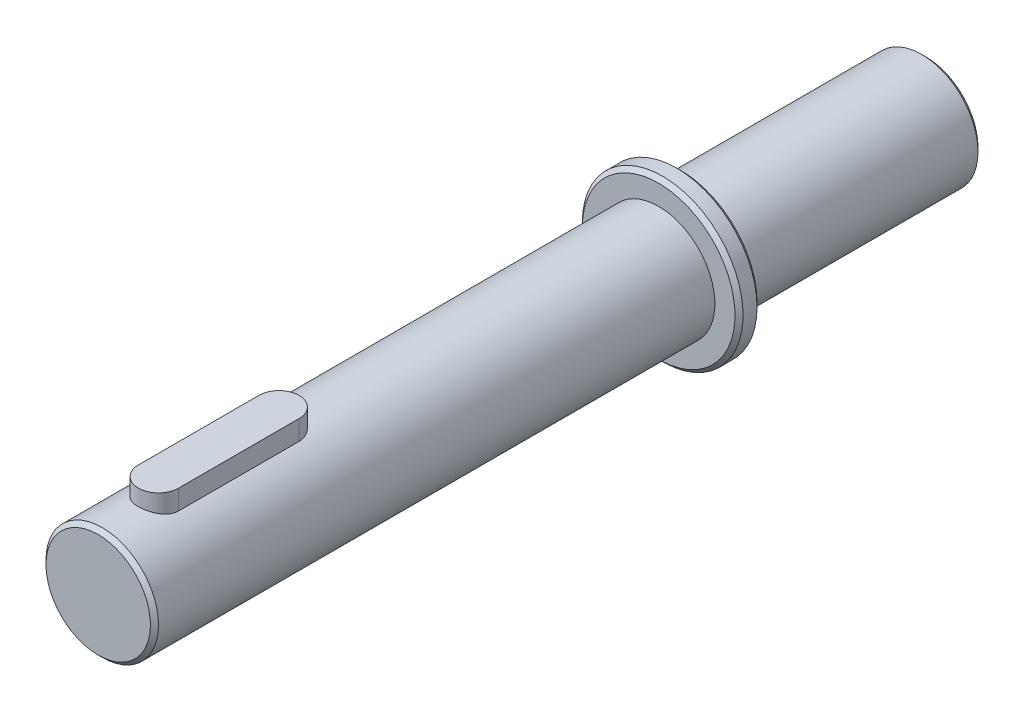
ISO-10303-21;
HEADER;
FILE_DESCRIPTION(('STEP AP214'),'2;1');
FILE_NAME('part.step','',(''),(''),'','','');
FILE_SCHEMA(('AUTOMOTIVE_DESIGN { 1 0 10303 214 1 1 1 1 }'));
ENDSEC;
DATA;
#1=APPLICATION_CONTEXT('core data for automotive mechanical design processes');
#2=APPLICATION_PROTOCOL_DEFINITION('international standard','automotive_design',2000,#1);
#3=PRODUCT_CONTEXT('',#1,'mechanical');
#4=PRODUCT('Part','Part','',(#3));
#5=PRODUCT_RELATED_PRODUCT_CATEGORY('part','',(#4));
#6=PRODUCT_DEFINITION_FORMATION('','',#4);
#7=PRODUCT_DEFINITION_CONTEXT('part definition',#1,'design');
#8=PRODUCT_DEFINITION('design','',#6,#7);
#9=PRODUCT_DEFINITION_SHAPE('','',#8);
#10=(LENGTH_UNIT() NAMED_UNIT(*) SI_UNIT(.MILLI.,.METRE.));
#11=(NAMED_UNIT(*) PLANE_ANGLE_UNIT() SI_UNIT($,.RADIAN.));
#12=(NAMED_UNIT(*) SI_UNIT($,.STERADIAN.) SOLID_ANGLE_UNIT());
#13=UNCERTAINTY_MEASURE_WITH_UNIT(LENGTH_MEASURE(1.E-05),#10,'distance_accuracy_value','');
#14=(GEOMETRIC_REPRESENTATION_CONTEXT(3) GLOBAL_UNCERTAINTY_ASSIGNED_CONTEXT((#13)) GLOBAL_UNIT_ASSIGNED_CONTEXT((#10,
#11,#12)) REPRESENTATION_CONTEXT('',''));
#15=CARTESIAN_POINT('',(0.,0.,0.));
#16=DIRECTION('',(0.,0.,1.));
#17=DIRECTION('',(1.,0.,0.));
#18=AXIS2_PLACEMENT_3D('',#15,#16,#17);
#19=CARTESIAN_POINT('',(0.,0.,103.));
#20=DIRECTION('',(0.,0.,-1.));
#21=DIRECTION('',(-1.,0.,0.));
#22=AXIS2_PLACEMENT_3D('',#19,#20,#21);
#23=CYLINDRICAL_SURFACE('',#22,7.);
#24=CARTESIAN_POINT('',(0.,0.,0.500000000000014));
#25=DIRECTION('',(0.,0.,1.));
#26=DIRECTION('',(1.,0.,0.));
#27=AXIS2_PLACEMENT_3D('',#24,#25,#26);
#28=CIRCLE('',#27,7.);
#29=CARTESIAN_POINT('',(7.,0.,0.500000000000014));
#30=VERTEX_POINT('',#29);
#31=EDGE_CURVE('E122',#30,#30,#28,.T.);
#32=ORIENTED_EDGE('',*,*,#31,.T.);
#33=EDGE_LOOP('',(#32));
#34=FACE_BOUND('',#33,.T.);
#35=CARTESIAN_POINT('',(0.,0.,30.5));
#36=DIRECTION('',(0.,0.,1.));
#37=DIRECTION('',(1.,0.,0.));
#38=AXIS2_PLACEMENT_3D('',#35,#36,#37);
#39=CIRCLE('',#38,7.);
#40=CARTESIAN_POINT('',(7.,0.,30.5));
#41=VERTEX_POINT('',#40);
#42=EDGE_CURVE('E113',#41,#41,#39,.T.);
#43=ORIENTED_EDGE('',*,*,#42,.F.);
#44=EDGE_LOOP('',(#43));
#45=FACE_BOUND('',#44,.T.);
#46=ADVANCED_FACE('F36',(#34,#45),#23,.T.);
#47=CARTESIAN_POINT('',(0.,0.,0.));
#48=DIRECTION('',(0.,0.,1.));
#49=DIRECTION('',(1.,0.,0.));
#50=AXIS2_PLACEMENT_3D('',#47,#48,#49);
#51=PLANE('',#50);
#52=CARTESIAN_POINT('',(0.,0.,0.));
#53=DIRECTION('',(0.,0.,1.));
#54=DIRECTION('',(1.,0.,0.));
#55=AXIS2_PLACEMENT_3D('',#52,#53,#54);
#56=CIRCLE('',#55,6.49999999999998);
#57=CARTESIAN_POINT('',(6.49999999999998,0.,0.));
#58=VERTEX_POINT('',#57);
#59=EDGE_CURVE('E125',#58,#58,#56,.F.);
#60=ORIENTED_EDGE('',*,*,#59,.T.);
#61=EDGE_LOOP('',(#60));
#62=FACE_BOUND('',#61,.T.);
#63=ADVANCED_FACE('F175',(#62),#51,.F.);
#64=CARTESIAN_POINT('',(0.,0.,0.));
#65=DIRECTION('',(0.,0.,-1.));
#66=DIRECTION('',(-1.,0.,0.));
#67=AXIS2_PLACEMENT_3D('',#64,#65,#66);
#68=CYLINDRICAL_SURFACE('',#67,10.);
#69=CARTESIAN_POINT('',(0.,0.,31.));
#70=DIRECTION('',(0.,0.,1.));
#71=DIRECTION('',(1.,0.,0.));
#72=AXIS2_PLACEMENT_3D('',#69,#70,#71);
#73=CIRCLE('',#72,10.);
#74=CARTESIAN_POINT('',(10.,0.,31.));
#75=VERTEX_POINT('',#74);
#76=EDGE_CURVE('E134',#75,#75,#73,.T.);
#77=ORIENTED_EDGE('',*,*,#76,.T.);
#78=EDGE_LOOP('',(#77));
#79=FACE_BOUND('',#78,.T.);
#80=CARTESIAN_POINT('',(0.,0.,32.75));
#81=DIRECTION('',(0.,0.,-1.));
#82=DIRECTION('',(-1.,0.,0.));
#83=AXIS2_PLACEMENT_3D('',#80,#81,#82);
#84=CIRCLE('',#83,10.);
#85=CARTESIAN_POINT('',(-10.,0.,32.75));
#86=VERTEX_POINT('',#85);
#87=EDGE_CURVE('E131',#86,#86,#84,.T.);
#88=ORIENTED_EDGE('',*,*,#87,.T.);
#89=EDGE_LOOP('',(#88));
#90=FACE_BOUND('',#89,.T.);
#91=ADVANCED_FACE('F171',(#79,#90),#68,.T.);
#92=CARTESIAN_POINT('',(5.,0.,30.5));
#93=DIRECTION('',(0.,0.,1.));
#94=DIRECTION('',(1.,0.,0.));
#95=AXIS2_PLACEMENT_3D('',#92,#93,#94);
#96=PLANE('',#95);
#97=CARTESIAN_POINT('',(0.,0.,30.5));
#98=DIRECTION('',(0.,0.,1.));
#99=DIRECTION('',(1.,0.,0.));
#100=AXIS2_PLACEMENT_3D('',#97,#98,#99);
#101=CIRCLE('',#100,9.50000000000002);
#102=CARTESIAN_POINT('',(9.50000000000002,0.,30.5));
#103=VERTEX_POINT('',#102);
#104=EDGE_CURVE('E128',#103,#103,#101,.F.);
#105=ORIENTED_EDGE('',*,*,#104,.T.);
#106=EDGE_LOOP('',(#105));
#107=FACE_BOUND('',#106,.T.);
#108=ORIENTED_EDGE('',*,*,#42,.T.);
#109=EDGE_LOOP('',(#108));
#110=FACE_BOUND('',#109,.T.);
#111=ADVANCED_FACE('F167',(#107,#110),#96,.F.);
#112=CARTESIAN_POINT('',(5.,0.,33.25));
#113=DIRECTION('',(0.,0.,-1.));
#114=DIRECTION('',(-1.,0.,0.));
#115=AXIS2_PLACEMENT_3D('',#112,#113,#114);
#116=PLANE('',#115);
#117=CARTESIAN_POINT('',(0.,0.,33.25));
#118=DIRECTION('',(0.,0.,-1.));
#119=DIRECTION('',(-1.,0.,0.));
#120=AXIS2_PLACEMENT_3D('',#117,#118,#119);
#121=CIRCLE('',#120,9.50000000000001);
#122=CARTESIAN_POINT('',(-9.5,0.,33.25));
#123=VERTEX_POINT('',#122);
#124=EDGE_CURVE('E137',#123,#123,#121,.F.);
#125=ORIENTED_EDGE('',*,*,#124,.T.);
#126=EDGE_LOOP('',(#125));
#127=FACE_BOUND('',#126,.T.);
#128=CARTESIAN_POINT('',(0.,0.,33.25));
#129=DIRECTION('',(0.,0.,-1.));
#130=DIRECTION('',(-1.,0.,0.));
#131=AXIS2_PLACEMENT_3D('',#128,#129,#130);
#132=CIRCLE('',#131,7.);
#133=CARTESIAN_POINT('',(-7.,0.,33.25));
#134=VERTEX_POINT('',#133);
#135=EDGE_CURVE('E107',#134,#134,#132,.T.);
#136=ORIENTED_EDGE('',*,*,#135,.T.);
#137=EDGE_LOOP('',(#136));
#138=FACE_BOUND('',#137,.T.);
#139=ADVANCED_FACE('F163',(#127,#138),#116,.F.);
#140=CARTESIAN_POINT('',(0.,0.,103.));
#141=DIRECTION('',(0.,0.,1.));
#142=DIRECTION('',(1.,0.,0.));
#143=AXIS2_PLACEMENT_3D('',#140,#141,#142);
#144=PLANE('',#143);
#145=CARTESIAN_POINT('',(0.,0.,103.));
#146=DIRECTION('',(0.,0.,1.));
#147=DIRECTION('',(1.,0.,0.));
#148=AXIS2_PLACEMENT_3D('',#145,#146,#147);
#149=CIRCLE('',#148,6.50000000000001);
#150=CARTESIAN_POINT('',(6.50000000000001,0.,103.));
#151=VERTEX_POINT('',#150);
#152=EDGE_CURVE('E116',#151,#151,#149,.T.);
#153=ORIENTED_EDGE('',*,*,#152,.T.);
#154=EDGE_LOOP('',(#153));
#155=FACE_BOUND('',#154,.T.);
#156=ADVANCED_FACE('F166',(#155),#144,.T.);
#157=DIRECTION('',(0.,0.,-1.));
#158=VECTOR('',#157,1.);
#159=CARTESIAN_POINT('',(-2.5,6.53834841531101,103.));
#160=LINE('',#159,#158);
#161=CARTESIAN_POINT('',(-2.5,6.53834841531101,95.5));
#162=VERTEX_POINT('',#161);
#163=CARTESIAN_POINT('',(-2.5,6.53834841531101,80.5));
#164=VERTEX_POINT('',#163);
#165=EDGE_CURVE('E140',#162,#164,#160,.T.);
#166=ORIENTED_EDGE('',*,*,#165,.T.);
#167=CARTESIAN_POINT('',(0.,7.,83.));
#168=CARTESIAN_POINT('',(-0.135839760518732,7.0000020295295,83.0000028240419));
#169=CARTESIAN_POINT('',(-0.271659429947528,6.99601056603649,82.9888932427672));
#170=CARTESIAN_POINT('',(-0.539264896606894,6.98048404948616,82.9449087128079));
#171=CARTESIAN_POINT('',(-0.671050847614626,6.96894928437749,82.9120345949352));
#172=CARTESIAN_POINT('',(-0.926692116674314,6.93958109810981,82.8258148587326));
#173=CARTESIAN_POINT('',(-1.05056137145919,6.92175912724346,82.7725064402801));
#174=CARTESIAN_POINT('',(-1.28759585298401,6.88161078032354,82.6471112806324));
#175=CARTESIAN_POINT('',(-1.40075850640075,6.85928332539979,82.575020040551));
#176=CARTESIAN_POINT('',(-1.61758802805346,6.81147377429754,82.4111568678836));
#177=CARTESIAN_POINT('',(-1.72078015672851,6.78590827445072,82.3187812689946));
#178=CARTESIAN_POINT('',(-1.9105819932243,6.73493522536265,82.1182536362102));
#179=CARTESIAN_POINT('',(-1.99718728701346,6.70952771990193,82.0100974162836));
#180=CARTESIAN_POINT('',(-2.15423735561842,6.6608007016897,81.7766022072243));
#181=CARTESIAN_POINT('',(-2.22403529794829,6.63758107761794,81.6508052564835));
#182=CARTESIAN_POINT('',(-2.34127572230002,6.59714352451506,81.3882963352957));
#183=CARTESIAN_POINT('',(-2.38872619231546,6.57992345154766,81.2515882854323));
#184=CARTESIAN_POINT('',(-2.45809130448528,6.55432038222057,80.9765771637975));
#185=CARTESIAN_POINT('',(-2.48090519407331,6.54562733379002,80.8385306930569));
#186=CARTESIAN_POINT('',(-2.5031615222748,6.53715061879805,80.5603163681762));
#187=CARTESIAN_POINT('',(-2.50261249605974,6.53736369856128,80.4201493074584));
#188=CARTESIAN_POINT('',(-2.4788507897233,6.54640588297195,80.1496443449475));
#189=CARTESIAN_POINT('',(-2.45685161763648,6.5547736366904,80.0191816470003));
#190=CARTESIAN_POINT('',(-2.39280851055059,6.57842082174382,79.7639384728166));
#191=CARTESIAN_POINT('',(-2.35076183734613,6.59370119723067,79.6391587753492));
#192=CARTESIAN_POINT('',(-2.247095668441,6.62975170487813,79.3962262542143));
#193=CARTESIAN_POINT('',(-2.18514195933256,6.65061447775042,79.2782303973415));
#194=CARTESIAN_POINT('',(-2.04365272690694,6.69544469696369,79.0539436133503));
#195=CARTESIAN_POINT('',(-1.96411154980233,6.71941314064672,78.9476564666926));
#196=CARTESIAN_POINT('',(-1.78403149047108,6.76952498465894,78.7430404086289));
#197=CARTESIAN_POINT('',(-1.68251331515439,6.7957122347435,78.6455821407508));
#198=CARTESIAN_POINT('',(-1.46426184534915,6.84605473605515,78.4688283171652));
#199=CARTESIAN_POINT('',(-1.3475266301937,6.87020973014027,78.3895350577013));
#200=CARTESIAN_POINT('',(-1.10010034292176,6.91416998722002,78.2505193900608));
#201=CARTESIAN_POINT('',(-0.969249112425213,6.93391532170414,78.1910617601102));
#202=CARTESIAN_POINT('',(-0.69852346812725,6.96639167687354,78.0952841758396));
#203=CARTESIAN_POINT('',(-0.558652699053769,6.97912551125634,78.0589549392374));
#204=CARTESIAN_POINT('',(-0.281205091813835,6.99566202632136,78.0120808493404));
#205=CARTESIAN_POINT('',(-0.143850613169093,6.99987103999093,78.0003618692543));
#206=CARTESIAN_POINT('',(0.130909371573395,7.00012297890716,77.9996548780098));
#207=CARTESIAN_POINT('',(0.268314862212673,6.99616751856457,78.0106623730082));
#208=CARTESIAN_POINT('',(0.534368698997773,6.98080349995239,78.0541861373216));
#209=CARTESIAN_POINT('',(0.663155848081403,6.96965417819419,78.0859547557982));
#210=CARTESIAN_POINT('',(0.913499444029998,6.94128245796678,78.1691365947361));
#211=CARTESIAN_POINT('',(1.03505494970017,6.9240592709991,78.2205523658286));
#212=CARTESIAN_POINT('',(1.27131790851501,6.88465739573327,78.3431588534016));
#213=CARTESIAN_POINT('',(1.38573546298722,6.86235262462323,78.4148664804994));
#214=CARTESIAN_POINT('',(1.6012793689737,6.81528395513799,78.5754274951074));
#215=CARTESIAN_POINT('',(1.70240114063959,6.79051921453451,78.6642867647738));
#216=CARTESIAN_POINT('',(1.89402292059753,6.73966040960453,78.8621296327289));
#217=CARTESIAN_POINT('',(1.98368681906969,6.71356479866296,78.9719247130197));
#218=CARTESIAN_POINT('',(2.14345525781598,6.6642787599771,79.2055412700044));
#219=CARTESIAN_POINT('',(2.21355884309556,6.64108847411013,79.3293634311286));
#220=CARTESIAN_POINT('',(2.33208686094212,6.60040332956606,79.5880648092361));
#221=CARTESIAN_POINT('',(2.38048810756041,6.58291456759543,79.7229556705099));
#222=CARTESIAN_POINT('',(2.45361419016748,6.55601442004241,79.9997601007201));
#223=CARTESIAN_POINT('',(2.4783518546378,6.54659865821928,80.1416698206623));
#224=CARTESIAN_POINT('',(2.50236255506863,6.53745596427834,80.419520479373));
#225=CARTESIAN_POINT('',(2.50304426978182,6.53719306756498,80.5553232144244));
#226=CARTESIAN_POINT('',(2.48247035008869,6.54503319463772,80.8249976706549));
#227=CARTESIAN_POINT('',(2.46121642244208,6.55313556754228,80.9588695412482));
#228=CARTESIAN_POINT('',(2.39843007607193,6.57636700427785,81.2175005853719));
#229=CARTESIAN_POINT('',(2.35741961008935,6.59131474248996,81.3424040990058));
#230=CARTESIAN_POINT('',(2.25672644338171,6.62646329315119,81.5836426818669));
#231=CARTESIAN_POINT('',(2.19703924956895,6.64666536944648,81.6999756809442));
#232=CARTESIAN_POINT('',(2.05730313071904,6.69127230994833,81.9269257499522));
#233=CARTESIAN_POINT('',(1.97640371595173,6.71583400336863,82.0369880408629));
#234=CARTESIAN_POINT('',(1.79790863011924,6.76580411328317,82.2424275046605));
#235=CARTESIAN_POINT('',(1.70030791033581,6.79121278393859,82.337800220351));
#236=CARTESIAN_POINT('',(1.48566252339524,6.84145445667706,82.5157219028166));
#237=CARTESIAN_POINT('',(1.36791750616705,6.86620367070764,82.5974530397909));
#238=CARTESIAN_POINT('',(1.11951131249464,6.91104924401845,82.7399076638379));
#239=CARTESIAN_POINT('',(0.988851114158942,6.93114595526313,82.8006327402027));
#240=CARTESIAN_POINT('',(0.71764633652499,6.96446006180832,82.8991403103086));
#241=CARTESIAN_POINT('',(0.57706256046779,6.97764821973896,82.9368254081627));
#242=CARTESIAN_POINT('',(0.290976881134825,6.99541542277591,82.9872488746388));
#243=CARTESIAN_POINT('',(0.14547691909783,6.99999782648543,82.9999969756064));
#244=CARTESIAN_POINT('',(0.,7.,83.));
#245=B_SPLINE_CURVE_WITH_KNOTS('',3,(#167,#168,#169,#170,#171,#172,#173,#174,#175,#176,#177,
#178,#179,#180,#181,#182,#183,#184,#185,#186,#187,#188,#189,#190,#191,#192,#193,#194,#195,#196,
#197,#198,#199,#200,#201,#202,#203,#204,#205,#206,#207,#208,#209,#210,#211,#212,#213,#214,#215,
#216,#217,#218,#219,#220,#221,#222,#223,#224,#225,#226,#227,#228,#229,#230,#231,#232,#233,#234,
#235,#236,#237,#238,#239,#240,#241,#242,#243,#244),.UNSPECIFIED.,.T.,.F.,(4,2,2,2,2,2,2,2,2,2,2,
2,2,2,2,2,2,2,2,2,2,2,2,2,2,2,2,2,2,2,2,2,2,2,2,2,2,2,4),(0.,0.406983217142951,
0.813950899519933,1.22018120425629,1.62650889940498,2.04714572459521,2.46789433314936,
2.90289606780333,3.3377421950035,3.75611562378725,4.17433620956453,4.57019246497949,
4.96610280426156,5.36904149669469,5.77210990935867,6.19956653135136,6.62707715847136,
7.06008524763626,7.49291944485573,7.90458529912081,8.31616976000826,8.71369326802827,
9.11126840085792,9.52005856953122,9.92898918269314,10.3593838463852,10.7897995195909,
11.2206739431307,11.6513146487842,12.0566930957309,12.4620400035307,12.8572208236401,
13.2524967861626,13.6670344525245,14.0816976535747,14.5159343578492,14.9501382011315,
15.3861650682914,15.8220217300551),.UNSPECIFIED.);
#246=CARTESIAN_POINT('',(2.5,6.53834841531101,80.5));
#247=VERTEX_POINT('',#246);
#248=EDGE_CURVE('E11',#164,#247,#245,.T.);
#249=ORIENTED_EDGE('',*,*,#248,.T.);
#250=DIRECTION('',(0.,0.,-1.));
#251=VECTOR('',#250,1.);
#252=CARTESIAN_POINT('',(2.5,6.53834841531101,103.));
#253=LINE('',#252,#251);
#254=CARTESIAN_POINT('',(2.5,6.53834841531101,95.5));
#255=VERTEX_POINT('',#254);
#256=EDGE_CURVE('E50',#247,#255,#253,.F.);
#257=ORIENTED_EDGE('',*,*,#256,.T.);
#258=CARTESIAN_POINT('',(0.,7.,98.));
#259=CARTESIAN_POINT('',(-0.135839760518735,7.0000020295295,98.0000028240419));
#260=CARTESIAN_POINT('',(-0.271659429947531,6.99601056603649,97.9888932427672));
#261=CARTESIAN_POINT('',(-0.539264896606898,6.98048404948616,97.9449087128079));
#262=CARTESIAN_POINT('',(-0.671050847614628,6.96894928437749,97.9120345949352));
#263=CARTESIAN_POINT('',(-0.926692116674318,6.93958109810981,97.8258148587326));
#264=CARTESIAN_POINT('',(-1.05056137145919,6.92175912724346,97.7725064402801));
#265=CARTESIAN_POINT('',(-1.28759585298402,6.88161078032354,97.6471112806324));
#266=CARTESIAN_POINT('',(-1.40075850640075,6.85928332539979,97.575020040551));
#267=CARTESIAN_POINT('',(-1.61758802805347,6.81147377429754,97.4111568678836));
#268=CARTESIAN_POINT('',(-1.72078015672851,6.78590827445072,97.3187812689946));
#269=CARTESIAN_POINT('',(-1.9105819932243,6.73493522536265,97.1182536362102));
#270=CARTESIAN_POINT('',(-1.99718728701346,6.70952771990193,97.0100974162836));
#271=CARTESIAN_POINT('',(-2.15423735561842,6.6608007016897,96.7766022072243));
#272=CARTESIAN_POINT('',(-2.2240352979483,6.63758107761794,96.6508052564835));
#273=CARTESIAN_POINT('',(-2.34127572230003,6.59714352451506,96.3882963352957));
#274=CARTESIAN_POINT('',(-2.38872619231546,6.57992345154766,96.2515882854323));
#275=CARTESIAN_POINT('',(-2.45809130448528,6.55432038222057,95.9765771637975));
#276=CARTESIAN_POINT('',(-2.48090519407331,6.54562733379002,95.8385306930569));
#277=CARTESIAN_POINT('',(-2.5031615222748,6.53715061879805,95.5603163681762));
#278=CARTESIAN_POINT('',(-2.50261249605974,6.53736369856128,95.4201493074584));
#279=CARTESIAN_POINT('',(-2.4788507897233,6.54640588297195,95.1496443449475));
#280=CARTESIAN_POINT('',(-2.45685161763648,6.5547736366904,95.0191816470003));
#281=CARTESIAN_POINT('',(-2.3928085105506,6.57842082174382,94.7639384728166));
#282=CARTESIAN_POINT('',(-2.35076183734613,6.59370119723067,94.6391587753492));
#283=CARTESIAN_POINT('',(-2.247095668441,6.62975170487813,94.3962262542143));
#284=CARTESIAN_POINT('',(-2.18514195933256,6.65061447775042,94.2782303973415));
#285=CARTESIAN_POINT('',(-2.04365272690694,6.69544469696369,94.0539436133503));
#286=CARTESIAN_POINT('',(-1.96411154980232,6.71941314064672,93.9476564666926));
#287=CARTESIAN_POINT('',(-1.78403149047108,6.76952498465894,93.7430404086289));
#288=CARTESIAN_POINT('',(-1.68251331515438,6.7957122347435,93.6455821407508));
#289=CARTESIAN_POINT('',(-1.46426184534915,6.84605473605515,93.4688283171652));
#290=CARTESIAN_POINT('',(-1.3475266301937,6.87020973014027,93.3895350577013));
#291=CARTESIAN_POINT('',(-1.10010034292176,6.91416998722001,93.2505193900608));
#292=CARTESIAN_POINT('',(-0.969249112425217,6.93391532170414,93.1910617601102));
#293=CARTESIAN_POINT('',(-0.698523468127255,6.96639167687354,93.0952841758396));
#294=CARTESIAN_POINT('',(-0.558652699053772,6.97912551125635,93.0589549392374));
#295=CARTESIAN_POINT('',(-0.281205091813837,6.99566202632136,93.0120808493404));
#296=CARTESIAN_POINT('',(-0.143850613169095,6.99987103999093,93.0003618692543));
#297=CARTESIAN_POINT('',(0.130909371573393,7.00012297890716,92.9996548780098));
#298=CARTESIAN_POINT('',(0.268314862212672,6.99616751856457,93.0106623730082));
#299=CARTESIAN_POINT('',(0.53436869899777,6.98080349995239,93.0541861373216));
#300=CARTESIAN_POINT('',(0.663155848081399,6.96965417819419,93.0859547557982));
#301=CARTESIAN_POINT('',(0.913499444029994,6.94128245796678,93.1691365947361));
#302=CARTESIAN_POINT('',(1.03505494970017,6.9240592709991,93.2205523658286));
#303=CARTESIAN_POINT('',(1.27131790851501,6.88465739573327,93.3431588534016));
#304=CARTESIAN_POINT('',(1.38573546298722,6.86235262462323,93.4148664804994));
#305=CARTESIAN_POINT('',(1.60127936897371,6.81528395513799,93.5754274951074));
#306=CARTESIAN_POINT('',(1.70240114063959,6.79051921453451,93.6642867647738));
#307=CARTESIAN_POINT('',(1.89402292059753,6.73966040960453,93.8621296327289));
#308=CARTESIAN_POINT('',(1.9836868190697,6.71356479866296,93.9719247130197));
#309=CARTESIAN_POINT('',(2.14345525781599,6.66427875997709,94.2055412700044));
#310=CARTESIAN_POINT('',(2.21355884309556,6.64108847411013,94.3293634311286));
#311=CARTESIAN_POINT('',(2.33208686094212,6.60040332956606,94.5880648092361));
#312=CARTESIAN_POINT('',(2.3804881075604,6.58291456759543,94.7229556705099));
#313=CARTESIAN_POINT('',(2.45361419016748,6.55601442004241,94.9997601007201));
#314=CARTESIAN_POINT('',(2.4783518546378,6.54659865821928,95.1416698206623));
#315=CARTESIAN_POINT('',(2.50236255506862,6.53745596427834,95.419520479373));
#316=CARTESIAN_POINT('',(2.50304426978182,6.53719306756498,95.5553232144244));
#317=CARTESIAN_POINT('',(2.48247035008869,6.54503319463772,95.8249976706549));
#318=CARTESIAN_POINT('',(2.46121642244208,6.55313556754228,95.9588695412482));
#319=CARTESIAN_POINT('',(2.39843007607193,6.57636700427785,96.2175005853719));
#320=CARTESIAN_POINT('',(2.35741961008935,6.59131474248996,96.3424040990058));
#321=CARTESIAN_POINT('',(2.2567264433817,6.62646329315119,96.5836426818669));
#322=CARTESIAN_POINT('',(2.19703924956894,6.64666536944648,96.6999756809442));
#323=CARTESIAN_POINT('',(2.05730313071904,6.69127230994833,96.9269257499523));
#324=CARTESIAN_POINT('',(1.97640371595173,6.71583400336863,97.0369880408629));
#325=CARTESIAN_POINT('',(1.79790863011923,6.76580411328317,97.2424275046605));
#326=CARTESIAN_POINT('',(1.70030791033581,6.79121278393859,97.337800220351));
#327=CARTESIAN_POINT('',(1.48566252339524,6.84145445667706,97.5157219028166));
#328=CARTESIAN_POINT('',(1.36791750616705,6.86620367070764,97.5974530397909));
#329=CARTESIAN_POINT('',(1.11951131249464,6.91104924401845,97.7399076638379));
#330=CARTESIAN_POINT('',(0.98885111415894,6.93114595526313,97.8006327402027));
#331=CARTESIAN_POINT('',(0.717646336524988,6.96446006180832,97.8991403103086));
#332=CARTESIAN_POINT('',(0.577062560467788,6.97764821973896,97.9368254081627));
#333=CARTESIAN_POINT('',(0.290976881134824,6.99541542277591,97.9872488746388));
#334=CARTESIAN_POINT('',(0.145476919097828,6.99999782648543,97.9999969756064));
#335=CARTESIAN_POINT('',(0.,7.,98.));
#336=B_SPLINE_CURVE_WITH_KNOTS('',3,(#258,#259,#260,#261,#262,#263,#264,#265,#266,#267,#268,
#269,#270,#271,#272,#273,#274,#275,#276,#277,#278,#279,#280,#281,#282,#283,#284,#285,#286,#287,
#288,#289,#290,#291,#292,#293,#294,#295,#296,#297,#298,#299,#300,#301,#302,#303,#304,#305,#306,
#307,#308,#309,#310,#311,#312,#313,#314,#315,#316,#317,#318,#319,#320,#321,#322,#323,#324,#325,
#326,#327,#328,#329,#330,#331,#332,#333,#334,#335),.UNSPECIFIED.,.T.,.F.,(4,2,2,2,2,2,2,2,2,2,2,
2,2,2,2,2,2,2,2,2,2,2,2,2,2,2,2,2,2,2,2,2,2,2,2,2,2,2,4),(0.,0.406983217142953,
0.813950899519933,1.2201812042563,1.62650889940498,2.04714572459521,2.46789433314938,
2.90289606780335,3.3377421950035,3.75611562378725,4.17433620956453,4.57019246497948,
4.96610280426156,5.3690414966947,5.77210990935867,6.19956653135137,6.62707715847136,
7.06008524763626,7.49291944485573,7.90458529912081,8.31616976000826,8.71369326802827,
9.11126840085792,9.52005856953123,9.92898918269314,10.3593838463852,10.7897995195909,
11.2206739431307,11.6513146487842,12.0566930957309,12.4620400035307,12.8572208236401,
13.2524967861626,13.6670344525245,14.0816976535747,14.5159343578492,14.9501382011315,
15.3861650682914,15.8220217300551),.UNSPECIFIED.);
#337=EDGE_CURVE('E142',#255,#162,#336,.T.);
#338=ORIENTED_EDGE('',*,*,#337,.T.);
#339=EDGE_LOOP('',(#166,#249,#257,#338));
#340=FACE_BOUND('',#339,.T.);
#341=CARTESIAN_POINT('',(0.,0.,102.5));
#342=DIRECTION('',(0.,0.,1.));
#343=DIRECTION('',(1.,0.,0.));
#344=AXIS2_PLACEMENT_3D('',#341,#342,#343);
#345=CIRCLE('',#344,7.);
#346=CARTESIAN_POINT('',(7.,0.,102.5));
#347=VERTEX_POINT('',#346);
#348=EDGE_CURVE('E119',#347,#347,#345,.F.);
#349=ORIENTED_EDGE('',*,*,#348,.T.);
#350=EDGE_LOOP('',(#349));
#351=FACE_BOUND('',#350,.T.);
#352=ORIENTED_EDGE('',*,*,#135,.F.);
#353=EDGE_LOOP('',(#352));
#354=FACE_BOUND('',#353,.T.);
#355=ADVANCED_FACE('F178',(#340,#351,#354),#23,.T.);
#356=CARTESIAN_POINT('',(0.,0.,103.));
#357=DIRECTION('',(0.,0.,-1.));
#358=DIRECTION('',(-1.,0.,0.));
#359=AXIS2_PLACEMENT_3D('',#356,#357,#358);
#360=CONICAL_SURFACE('',#359,6.50000000000001,0.785398163397455);
#361=ORIENTED_EDGE('',*,*,#348,.F.);
#362=EDGE_LOOP('',(#361));
#363=FACE_BOUND('',#362,.T.);
#364=ORIENTED_EDGE('',*,*,#152,.F.);
#365=EDGE_LOOP('',(#364));
#366=FACE_BOUND('',#365,.T.);
#367=ADVANCED_FACE('F192',(#363,#366),#360,.T.);
#368=CARTESIAN_POINT('',(0.,0.,0.500000000000014));
#369=DIRECTION('',(0.,0.,1.));
#370=DIRECTION('',(1.,0.,0.));
#371=AXIS2_PLACEMENT_3D('',#368,#369,#370);
#372=CONICAL_SURFACE('',#371,7.,0.785398163397454);
#373=ORIENTED_EDGE('',*,*,#59,.F.);
#374=EDGE_LOOP('',(#373));
#375=FACE_BOUND('',#374,.T.);
#376=ORIENTED_EDGE('',*,*,#31,.F.);
#377=EDGE_LOOP('',(#376));
#378=FACE_BOUND('',#377,.T.);
#379=ADVANCED_FACE('F188',(#375,#378),#372,.T.);
#380=CARTESIAN_POINT('',(0.,0.,30.5));
#381=DIRECTION('',(0.,0.,1.));
#382=DIRECTION('',(1.,0.,0.));
#383=AXIS2_PLACEMENT_3D('',#380,#381,#382);
#384=CONICAL_SURFACE('',#383,9.50000000000002,0.785398163397441);
#385=ORIENTED_EDGE('',*,*,#76,.F.);
#386=EDGE_LOOP('',(#385));
#387=FACE_BOUND('',#386,.T.);
#388=ORIENTED_EDGE('',*,*,#104,.F.);
#389=EDGE_LOOP('',(#388));
#390=FACE_BOUND('',#389,.T.);
#391=ADVANCED_FACE('F191',(#387,#390),#384,.T.);
#392=CARTESIAN_POINT('',(0.,0.,32.75));
#393=DIRECTION('',(0.,0.,-1.));
#394=DIRECTION('',(-1.,0.,0.));
#395=AXIS2_PLACEMENT_3D('',#392,#393,#394);
#396=CONICAL_SURFACE('',#395,10.,0.785398163397428);
#397=ORIENTED_EDGE('',*,*,#124,.F.);
#398=EDGE_LOOP('',(#397));
#399=FACE_BOUND('',#398,.T.);
#400=ORIENTED_EDGE('',*,*,#87,.F.);
#401=EDGE_LOOP('',(#400));
#402=FACE_BOUND('',#401,.T.);
#403=ADVANCED_FACE('F39',(#399,#402),#396,.T.);
#404=CARTESIAN_POINT('',(0.,5.,80.5));
#405=DIRECTION('',(0.,1.,0.));
#406=DIRECTION('',(0.,0.,1.));
#407=AXIS2_PLACEMENT_3D('',#404,#405,#406);
#408=CYLINDRICAL_SURFACE('',#407,2.5);
#409=ORIENTED_EDGE('',*,*,#248,.F.);
#410=DIRECTION('',(0.,1.,0.));
#411=VECTOR('',#410,1.);
#412=CARTESIAN_POINT('',(-2.5,5.,80.5));
#413=LINE('',#412,#411);
#414=CARTESIAN_POINT('',(-2.5,9.,80.5));
#415=VERTEX_POINT('',#414);
#416=EDGE_CURVE('E57',#164,#415,#413,.T.);
#417=ORIENTED_EDGE('',*,*,#416,.T.);
#418=CARTESIAN_POINT('',(0.,9.,80.5));
#419=DIRECTION('',(0.,1.,0.));
#420=DIRECTION('',(0.,0.,1.));
#421=AXIS2_PLACEMENT_3D('',#418,#419,#420);
#422=CIRCLE('',#421,2.5);
#423=CARTESIAN_POINT('',(2.5,9.,80.5));
#424=VERTEX_POINT('',#423);
#425=EDGE_CURVE('E84',#424,#415,#422,.T.);
#426=ORIENTED_EDGE('',*,*,#425,.F.);
#427=DIRECTION('',(0.,1.,0.));
#428=VECTOR('',#427,1.);
#429=CARTESIAN_POINT('',(2.5,5.,80.5));
#430=LINE('',#429,#428);
#431=EDGE_CURVE('E105',#247,#424,#430,.T.);
#432=ORIENTED_EDGE('',*,*,#431,.F.);
#433=EDGE_LOOP('',(#409,#417,#426,#432));
#434=FACE_BOUND('',#433,.T.);
#435=ADVANCED_FACE('F82',(#434),#408,.T.);
#436=CARTESIAN_POINT('',(2.5,5.,80.5));
#437=DIRECTION('',(1.,0.,0.));
#438=DIRECTION('',(0.,0.,-1.));
#439=AXIS2_PLACEMENT_3D('',#436,#437,#438);
#440=PLANE('',#439);
#441=ORIENTED_EDGE('',*,*,#256,.F.);
#442=ORIENTED_EDGE('',*,*,#431,.T.);
#443=DIRECTION('',(0.,0.,-1.));
#444=VECTOR('',#443,1.);
#445=CARTESIAN_POINT('',(2.5,9.,80.5));
#446=LINE('',#445,#444);
#447=CARTESIAN_POINT('',(2.5,9.,95.5));
#448=VERTEX_POINT('',#447);
#449=EDGE_CURVE('E87',#448,#424,#446,.T.);
#450=ORIENTED_EDGE('',*,*,#449,.F.);
#451=DIRECTION('',(0.,1.,0.));
#452=VECTOR('',#451,1.);
#453=CARTESIAN_POINT('',(2.5,5.,95.5));
#454=LINE('',#453,#452);
#455=EDGE_CURVE('E108',#255,#448,#454,.T.);
#456=ORIENTED_EDGE('',*,*,#455,.F.);
#457=EDGE_LOOP('',(#441,#442,#450,#456));
#458=FACE_BOUND('',#457,.T.);
#459=ADVANCED_FACE('F156',(#458),#440,.T.);
#460=CARTESIAN_POINT('',(0.,5.,95.5));
#461=DIRECTION('',(0.,1.,0.));
#462=DIRECTION('',(0.,0.,1.));
#463=AXIS2_PLACEMENT_3D('',#460,#461,#462);
#464=CYLINDRICAL_SURFACE('',#463,2.5);
#465=ORIENTED_EDGE('',*,*,#337,.F.);
#466=ORIENTED_EDGE('',*,*,#455,.T.);
#467=CARTESIAN_POINT('',(0.,9.,95.5));
#468=DIRECTION('',(0.,1.,0.));
#469=DIRECTION('',(0.,0.,1.));
#470=AXIS2_PLACEMENT_3D('',#467,#468,#469);
#471=CIRCLE('',#470,2.5);
#472=CARTESIAN_POINT('',(-2.5,9.,95.5));
#473=VERTEX_POINT('',#472);
#474=EDGE_CURVE('E96',#473,#448,#471,.T.);
#475=ORIENTED_EDGE('',*,*,#474,.F.);
#476=DIRECTION('',(0.,1.,0.));
#477=VECTOR('',#476,1.);
#478=CARTESIAN_POINT('',(-2.5,5.,95.5));
#479=LINE('',#478,#477);
#480=EDGE_CURVE('E86',#162,#473,#479,.T.);
#481=ORIENTED_EDGE('',*,*,#480,.F.);
#482=EDGE_LOOP('',(#465,#466,#475,#481));
#483=FACE_BOUND('',#482,.T.);
#484=ADVANCED_FACE('F151',(#483),#464,.T.);
#485=CARTESIAN_POINT('',(-2.5,5.,80.5));
#486=DIRECTION('',(-1.,0.,0.));
#487=DIRECTION('',(0.,0.,1.));
#488=AXIS2_PLACEMENT_3D('',#485,#486,#487);
#489=PLANE('',#488);
#490=ORIENTED_EDGE('',*,*,#165,.F.);
#491=ORIENTED_EDGE('',*,*,#480,.T.);
#492=DIRECTION('',(0.,0.,1.));
#493=VECTOR('',#492,1.);
#494=CARTESIAN_POINT('',(-2.5,9.,80.5));
#495=LINE('',#494,#493);
#496=EDGE_CURVE('E90',#415,#473,#495,.T.);
#497=ORIENTED_EDGE('',*,*,#496,.F.);
#498=ORIENTED_EDGE('',*,*,#416,.F.);
#499=EDGE_LOOP('',(#490,#491,#497,#498));
#500=FACE_BOUND('',#499,.T.);
#501=ADVANCED_FACE('F91',(#500),#489,.T.);
#502=CARTESIAN_POINT('',(0.,9.,80.5));
#503=DIRECTION('',(0.,1.,0.));
#504=DIRECTION('',(0.,0.,1.));
#505=AXIS2_PLACEMENT_3D('',#502,#503,#504);
#506=PLANE('',#505);
#507=ORIENTED_EDGE('',*,*,#425,.T.);
#508=ORIENTED_EDGE('',*,*,#496,.T.);
#509=ORIENTED_EDGE('',*,*,#474,.T.);
#510=ORIENTED_EDGE('',*,*,#449,.T.);
#511=EDGE_LOOP('',(#507,#508,#509,#510));
#512=FACE_BOUND('',#511,.T.);
#513=ADVANCED_FACE('F99',(#512),#506,.T.);
#514=CLOSED_SHELL('',(#46,#63,#91,#111,#139,#156,#355,#367,#379,#391,#403,#435,#459,#484,#501,#513));
#515=MANIFOLD_SOLID_BREP('B2',#514);
#516=ADVANCED_BREP_SHAPE_REPRESENTATION('',(#18,#515),#14);
#517=SHAPE_DEFINITION_REPRESENTATION(#9,#516);
ENDSEC;
END-ISO-10303-21;
